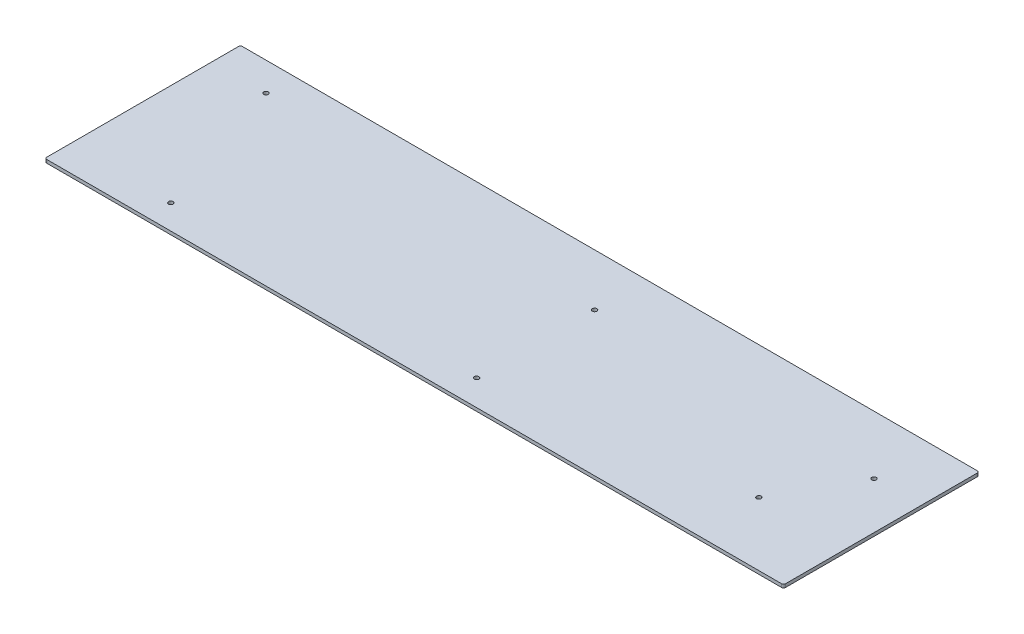
ISO-10303-21;
HEADER;
FILE_DESCRIPTION(('STEP AP214'),'2;1');
FILE_NAME('part.step','',(''),(''),'','','');
FILE_SCHEMA(('AUTOMOTIVE_DESIGN { 1 0 10303 214 1 1 1 1 }'));
ENDSEC;
DATA;
#1=APPLICATION_CONTEXT('core data for automotive mechanical design processes');
#2=APPLICATION_PROTOCOL_DEFINITION('international standard','automotive_design',2000,#1);
#3=PRODUCT_CONTEXT('',#1,'mechanical');
#4=PRODUCT('Part','Part','',(#3));
#5=PRODUCT_RELATED_PRODUCT_CATEGORY('part','',(#4));
#6=PRODUCT_DEFINITION_FORMATION('','',#4);
#7=PRODUCT_DEFINITION_CONTEXT('part definition',#1,'design');
#8=PRODUCT_DEFINITION('design','',#6,#7);
#9=PRODUCT_DEFINITION_SHAPE('','',#8);
#10=(LENGTH_UNIT() NAMED_UNIT(*) SI_UNIT(.MILLI.,.METRE.));
#11=(NAMED_UNIT(*) PLANE_ANGLE_UNIT() SI_UNIT($,.RADIAN.));
#12=(NAMED_UNIT(*) SI_UNIT($,.STERADIAN.) SOLID_ANGLE_UNIT());
#13=UNCERTAINTY_MEASURE_WITH_UNIT(LENGTH_MEASURE(1.E-05),#10,'distance_accuracy_value','');
#14=(GEOMETRIC_REPRESENTATION_CONTEXT(3) GLOBAL_UNCERTAINTY_ASSIGNED_CONTEXT((#13)) GLOBAL_UNIT_ASSIGNED_CONTEXT((#10,
#11,#12)) REPRESENTATION_CONTEXT('',''));
#15=CARTESIAN_POINT('',(0.,0.,0.));
#16=DIRECTION('',(0.,0.,1.));
#17=DIRECTION('',(1.,0.,0.));
#18=AXIS2_PLACEMENT_3D('',#15,#16,#17);
#19=CARTESIAN_POINT('',(178.825,1.6,46.625));
#20=DIRECTION('',(0.,1.,0.));
#21=DIRECTION('',(0.,0.,1.));
#22=AXIS2_PLACEMENT_3D('',#19,#20,#21);
#23=PLANE('',#22);
#24=CARTESIAN_POINT('',(17.875,1.6,35.075));
#25=DIRECTION('',(0.,1.,0.));
#26=DIRECTION('',(0.,0.,1.));
#27=AXIS2_PLACEMENT_3D('',#24,#25,#26);
#28=CIRCLE('',#27,1.09999999999999);
#29=CARTESIAN_POINT('',(17.875,1.6,36.175));
#30=VERTEX_POINT('',#29);
#31=EDGE_CURVE('E200',#30,#30,#28,.T.);
#32=ORIENTED_EDGE('',*,*,#31,.F.);
#33=EDGE_LOOP('',(#32));
#34=FACE_BOUND('',#33,.T.);
#35=CARTESIAN_POINT('',(-153.475,1.6,-33.725));
#36=DIRECTION('',(0.,1.,0.));
#37=DIRECTION('',(0.,0.,1.));
#38=AXIS2_PLACEMENT_3D('',#35,#36,#37);
#39=CIRCLE('',#38,1.09999999999999);
#40=CARTESIAN_POINT('',(-153.475,1.6,-32.625));
#41=VERTEX_POINT('',#40);
#42=EDGE_CURVE('E188',#41,#41,#39,.T.);
#43=ORIENTED_EDGE('',*,*,#42,.F.);
#44=EDGE_LOOP('',(#43));
#45=FACE_BOUND('',#44,.T.);
#46=CARTESIAN_POINT('',(157.075,1.6,-19.175));
#47=DIRECTION('',(0.,1.,0.));
#48=DIRECTION('',(0.,0.,1.));
#49=AXIS2_PLACEMENT_3D('',#46,#47,#48);
#50=CIRCLE('',#49,1.09999999999999);
#51=CARTESIAN_POINT('',(157.075,1.6,-18.075));
#52=VERTEX_POINT('',#51);
#53=EDGE_CURVE('E134',#52,#52,#50,.T.);
#54=ORIENTED_EDGE('',*,*,#53,.F.);
#55=EDGE_LOOP('',(#54));
#56=FACE_BOUND('',#55,.T.);
#57=CARTESIAN_POINT('',(178.825,1.6,46.625));
#58=DIRECTION('',(0.,1.,0.));
#59=DIRECTION('',(0.,0.,1.));
#60=AXIS2_PLACEMENT_3D('',#57,#58,#59);
#61=CIRCLE('',#60,0.999999999999987);
#62=CARTESIAN_POINT('',(178.825,1.6,47.625));
#63=VERTEX_POINT('',#62);
#64=CARTESIAN_POINT('',(179.825,1.6,46.625));
#65=VERTEX_POINT('',#64);
#66=EDGE_CURVE('E145',#63,#65,#61,.T.);
#67=ORIENTED_EDGE('',*,*,#66,.T.);
#68=DIRECTION('',(0.,0.,-1.));
#69=VECTOR('',#68,1.);
#70=CARTESIAN_POINT('',(179.825,1.6,-46.625));
#71=LINE('',#70,#69);
#72=CARTESIAN_POINT('',(179.825,1.6,-46.625));
#73=VERTEX_POINT('',#72);
#74=EDGE_CURVE('E93',#65,#73,#71,.T.);
#75=ORIENTED_EDGE('',*,*,#74,.T.);
#76=CARTESIAN_POINT('',(178.825,1.6,-46.625));
#77=DIRECTION('',(0.,1.,0.));
#78=DIRECTION('',(0.,0.,-1.));
#79=AXIS2_PLACEMENT_3D('',#76,#77,#78);
#80=CIRCLE('',#79,0.999999999999987);
#81=CARTESIAN_POINT('',(178.825,1.6,-47.625));
#82=VERTEX_POINT('',#81);
#83=EDGE_CURVE('E160',#73,#82,#80,.T.);
#84=ORIENTED_EDGE('',*,*,#83,.T.);
#85=DIRECTION('',(-1.,0.,0.));
#86=VECTOR('',#85,1.);
#87=CARTESIAN_POINT('',(-178.825,1.6,-47.625));
#88=LINE('',#87,#86);
#89=CARTESIAN_POINT('',(-178.825,1.6,-47.625));
#90=VERTEX_POINT('',#89);
#91=EDGE_CURVE('E173',#82,#90,#88,.T.);
#92=ORIENTED_EDGE('',*,*,#91,.T.);
#93=CARTESIAN_POINT('',(-178.825,1.6,-46.625));
#94=DIRECTION('',(0.,1.,0.));
#95=DIRECTION('',(0.,0.,1.));
#96=AXIS2_PLACEMENT_3D('',#93,#94,#95);
#97=CIRCLE('',#96,1.);
#98=CARTESIAN_POINT('',(-179.825,1.6,-46.625));
#99=VERTEX_POINT('',#98);
#100=EDGE_CURVE('E112',#90,#99,#97,.T.);
#101=ORIENTED_EDGE('',*,*,#100,.T.);
#102=DIRECTION('',(0.,0.,1.));
#103=VECTOR('',#102,1.);
#104=CARTESIAN_POINT('',(-179.825,1.6,-46.625));
#105=LINE('',#104,#103);
#106=CARTESIAN_POINT('',(-179.825,1.6,46.625));
#107=VERTEX_POINT('',#106);
#108=EDGE_CURVE('E106',#99,#107,#105,.T.);
#109=ORIENTED_EDGE('',*,*,#108,.T.);
#110=CARTESIAN_POINT('',(-178.825,1.6,46.625));
#111=DIRECTION('',(0.,1.,0.));
#112=DIRECTION('',(0.,0.,1.));
#113=AXIS2_PLACEMENT_3D('',#110,#111,#112);
#114=CIRCLE('',#113,1.);
#115=CARTESIAN_POINT('',(-178.825,1.6,47.625));
#116=VERTEX_POINT('',#115);
#117=EDGE_CURVE('E110',#107,#116,#114,.T.);
#118=ORIENTED_EDGE('',*,*,#117,.T.);
#119=DIRECTION('',(1.,0.,0.));
#120=VECTOR('',#119,1.);
#121=CARTESIAN_POINT('',(-178.825,1.6,47.625));
#122=LINE('',#121,#120);
#123=EDGE_CURVE('E50',#116,#63,#122,.T.);
#124=ORIENTED_EDGE('',*,*,#123,.T.);
#125=EDGE_LOOP('',(#67,#75,#84,#92,#101,#109,#118,#124));
#126=FACE_BOUND('',#125,.T.);
#127=CARTESIAN_POINT('',(136.925,1.6,16.775));
#128=DIRECTION('',(0.,1.,0.));
#129=DIRECTION('',(0.,0.,1.));
#130=AXIS2_PLACEMENT_3D('',#127,#128,#129);
#131=CIRCLE('',#130,1.09999999999999);
#132=CARTESIAN_POINT('',(136.925,1.6,17.875));
#133=VERTEX_POINT('',#132);
#134=EDGE_CURVE('E182',#133,#133,#131,.T.);
#135=ORIENTED_EDGE('',*,*,#134,.F.);
#136=EDGE_LOOP('',(#135));
#137=FACE_BOUND('',#136,.T.);
#138=CARTESIAN_POINT('',(17.925,1.6,-22.275));
#139=DIRECTION('',(0.,1.,0.));
#140=DIRECTION('',(0.,0.,1.));
#141=AXIS2_PLACEMENT_3D('',#138,#139,#140);
#142=CIRCLE('',#141,1.1);
#143=CARTESIAN_POINT('',(17.925,1.6,-21.175));
#144=VERTEX_POINT('',#143);
#145=EDGE_CURVE('E194',#144,#144,#142,.T.);
#146=ORIENTED_EDGE('',*,*,#145,.F.);
#147=EDGE_LOOP('',(#146));
#148=FACE_BOUND('',#147,.T.);
#149=CARTESIAN_POINT('',(-130.375,1.6,35.725));
#150=DIRECTION('',(0.,1.,0.));
#151=DIRECTION('',(0.,0.,1.));
#152=AXIS2_PLACEMENT_3D('',#149,#150,#151);
#153=CIRCLE('',#152,1.10000000000002);
#154=CARTESIAN_POINT('',(-130.375,1.6,36.825));
#155=VERTEX_POINT('',#154);
#156=EDGE_CURVE('E206',#155,#155,#153,.T.);
#157=ORIENTED_EDGE('',*,*,#156,.F.);
#158=EDGE_LOOP('',(#157));
#159=FACE_BOUND('',#158,.T.);
#160=ADVANCED_FACE('F33',(#34,#45,#56,#126,#137,#148,#159),#23,.T.);
#161=CARTESIAN_POINT('',(178.825,0.,46.625));
#162=DIRECTION('',(0.,1.,0.));
#163=DIRECTION('',(0.,0.,1.));
#164=AXIS2_PLACEMENT_3D('',#161,#162,#163);
#165=PLANE('',#164);
#166=CARTESIAN_POINT('',(178.825,0.,46.625));
#167=DIRECTION('',(0.,1.,0.));
#168=DIRECTION('',(0.,0.,1.));
#169=AXIS2_PLACEMENT_3D('',#166,#167,#168);
#170=CIRCLE('',#169,0.999999999999987);
#171=CARTESIAN_POINT('',(178.825,0.,47.625));
#172=VERTEX_POINT('',#171);
#173=CARTESIAN_POINT('',(179.825,0.,46.625));
#174=VERTEX_POINT('',#173);
#175=EDGE_CURVE('E130',#172,#174,#170,.T.);
#176=ORIENTED_EDGE('',*,*,#175,.F.);
#177=DIRECTION('',(1.,0.,0.));
#178=VECTOR('',#177,1.);
#179=CARTESIAN_POINT('',(-178.825,0.,47.625));
#180=LINE('',#179,#178);
#181=CARTESIAN_POINT('',(-178.825,0.,47.625));
#182=VERTEX_POINT('',#181);
#183=EDGE_CURVE('E85',#182,#172,#180,.T.);
#184=ORIENTED_EDGE('',*,*,#183,.F.);
#185=CARTESIAN_POINT('',(-178.825,0.,46.625));
#186=DIRECTION('',(0.,1.,0.));
#187=DIRECTION('',(0.,0.,1.));
#188=AXIS2_PLACEMENT_3D('',#185,#186,#187);
#189=CIRCLE('',#188,1.);
#190=CARTESIAN_POINT('',(-179.825,0.,46.625));
#191=VERTEX_POINT('',#190);
#192=EDGE_CURVE('E79',#191,#182,#189,.T.);
#193=ORIENTED_EDGE('',*,*,#192,.F.);
#194=DIRECTION('',(0.,0.,1.));
#195=VECTOR('',#194,1.);
#196=CARTESIAN_POINT('',(-179.825,0.,-46.625));
#197=LINE('',#196,#195);
#198=CARTESIAN_POINT('',(-179.825,0.,-46.625));
#199=VERTEX_POINT('',#198);
#200=EDGE_CURVE('E120',#199,#191,#197,.T.);
#201=ORIENTED_EDGE('',*,*,#200,.F.);
#202=CARTESIAN_POINT('',(-178.825,0.,-46.625));
#203=DIRECTION('',(0.,1.,0.));
#204=DIRECTION('',(0.,0.,1.));
#205=AXIS2_PLACEMENT_3D('',#202,#203,#204);
#206=CIRCLE('',#205,1.);
#207=CARTESIAN_POINT('',(-178.825,0.,-47.625));
#208=VERTEX_POINT('',#207);
#209=EDGE_CURVE('E140',#208,#199,#206,.T.);
#210=ORIENTED_EDGE('',*,*,#209,.F.);
#211=DIRECTION('',(-1.,0.,0.));
#212=VECTOR('',#211,1.);
#213=CARTESIAN_POINT('',(-178.825,0.,-47.625));
#214=LINE('',#213,#212);
#215=CARTESIAN_POINT('',(178.825,0.,-47.625));
#216=VERTEX_POINT('',#215);
#217=EDGE_CURVE('E138',#216,#208,#214,.T.);
#218=ORIENTED_EDGE('',*,*,#217,.F.);
#219=CARTESIAN_POINT('',(178.825,0.,-46.625));
#220=DIRECTION('',(0.,1.,0.));
#221=DIRECTION('',(0.,0.,-1.));
#222=AXIS2_PLACEMENT_3D('',#219,#220,#221);
#223=CIRCLE('',#222,0.999999999999987);
#224=CARTESIAN_POINT('',(179.825,0.,-46.625));
#225=VERTEX_POINT('',#224);
#226=EDGE_CURVE('E136',#225,#216,#223,.T.);
#227=ORIENTED_EDGE('',*,*,#226,.F.);
#228=DIRECTION('',(0.,0.,-1.));
#229=VECTOR('',#228,1.);
#230=CARTESIAN_POINT('',(179.825,0.,-46.625));
#231=LINE('',#230,#229);
#232=EDGE_CURVE('E133',#174,#225,#231,.T.);
#233=ORIENTED_EDGE('',*,*,#232,.F.);
#234=EDGE_LOOP('',(#176,#184,#193,#201,#210,#218,#227,#233));
#235=FACE_BOUND('',#234,.T.);
#236=CARTESIAN_POINT('',(157.075,0.,-19.175));
#237=DIRECTION('',(0.,1.,0.));
#238=DIRECTION('',(0.,0.,1.));
#239=AXIS2_PLACEMENT_3D('',#236,#237,#238);
#240=CIRCLE('',#239,1.09999999999999);
#241=CARTESIAN_POINT('',(157.075,0.,-18.075));
#242=VERTEX_POINT('',#241);
#243=EDGE_CURVE('E179',#242,#242,#240,.T.);
#244=ORIENTED_EDGE('',*,*,#243,.T.);
#245=EDGE_LOOP('',(#244));
#246=FACE_BOUND('',#245,.T.);
#247=CARTESIAN_POINT('',(136.925,0.,16.775));
#248=DIRECTION('',(0.,1.,0.));
#249=DIRECTION('',(0.,0.,1.));
#250=AXIS2_PLACEMENT_3D('',#247,#248,#249);
#251=CIRCLE('',#250,1.09999999999999);
#252=CARTESIAN_POINT('',(136.925,0.,17.875));
#253=VERTEX_POINT('',#252);
#254=EDGE_CURVE('E185',#253,#253,#251,.T.);
#255=ORIENTED_EDGE('',*,*,#254,.T.);
#256=EDGE_LOOP('',(#255));
#257=FACE_BOUND('',#256,.T.);
#258=CARTESIAN_POINT('',(-153.475,0.,-33.725));
#259=DIRECTION('',(0.,1.,0.));
#260=DIRECTION('',(0.,0.,1.));
#261=AXIS2_PLACEMENT_3D('',#258,#259,#260);
#262=CIRCLE('',#261,1.09999999999999);
#263=CARTESIAN_POINT('',(-153.475,0.,-32.625));
#264=VERTEX_POINT('',#263);
#265=EDGE_CURVE('E191',#264,#264,#262,.T.);
#266=ORIENTED_EDGE('',*,*,#265,.T.);
#267=EDGE_LOOP('',(#266));
#268=FACE_BOUND('',#267,.T.);
#269=CARTESIAN_POINT('',(17.925,0.,-22.275));
#270=DIRECTION('',(0.,1.,0.));
#271=DIRECTION('',(0.,0.,1.));
#272=AXIS2_PLACEMENT_3D('',#269,#270,#271);
#273=CIRCLE('',#272,1.1);
#274=CARTESIAN_POINT('',(17.925,0.,-21.175));
#275=VERTEX_POINT('',#274);
#276=EDGE_CURVE('E197',#275,#275,#273,.T.);
#277=ORIENTED_EDGE('',*,*,#276,.T.);
#278=EDGE_LOOP('',(#277));
#279=FACE_BOUND('',#278,.T.);
#280=CARTESIAN_POINT('',(17.875,0.,35.075));
#281=DIRECTION('',(0.,1.,0.));
#282=DIRECTION('',(0.,0.,1.));
#283=AXIS2_PLACEMENT_3D('',#280,#281,#282);
#284=CIRCLE('',#283,1.09999999999999);
#285=CARTESIAN_POINT('',(17.875,0.,36.175));
#286=VERTEX_POINT('',#285);
#287=EDGE_CURVE('E203',#286,#286,#284,.T.);
#288=ORIENTED_EDGE('',*,*,#287,.T.);
#289=EDGE_LOOP('',(#288));
#290=FACE_BOUND('',#289,.T.);
#291=CARTESIAN_POINT('',(-130.375,0.,35.725));
#292=DIRECTION('',(0.,1.,0.));
#293=DIRECTION('',(0.,0.,1.));
#294=AXIS2_PLACEMENT_3D('',#291,#292,#293);
#295=CIRCLE('',#294,1.10000000000002);
#296=CARTESIAN_POINT('',(-130.375,0.,36.825));
#297=VERTEX_POINT('',#296);
#298=EDGE_CURVE('E209',#297,#297,#295,.T.);
#299=ORIENTED_EDGE('',*,*,#298,.T.);
#300=EDGE_LOOP('',(#299));
#301=FACE_BOUND('',#300,.T.);
#302=ADVANCED_FACE('F164',(#235,#246,#257,#268,#279,#290,#301),#165,.F.);
#303=CARTESIAN_POINT('',(178.825,1.6,46.625));
#304=DIRECTION('',(0.,-1.,0.));
#305=DIRECTION('',(0.,0.,-1.));
#306=AXIS2_PLACEMENT_3D('',#303,#304,#305);
#307=CYLINDRICAL_SURFACE('',#306,0.999999999999987);
#308=ORIENTED_EDGE('',*,*,#175,.T.);
#309=DIRECTION('',(0.,-1.,0.));
#310=VECTOR('',#309,1.);
#311=CARTESIAN_POINT('',(179.825,1.6,46.625));
#312=LINE('',#311,#310);
#313=EDGE_CURVE('E11',#65,#174,#312,.T.);
#314=ORIENTED_EDGE('',*,*,#313,.F.);
#315=ORIENTED_EDGE('',*,*,#66,.F.);
#316=DIRECTION('',(0.,-1.,0.));
#317=VECTOR('',#316,1.);
#318=CARTESIAN_POINT('',(178.825,1.6,47.625));
#319=LINE('',#318,#317);
#320=EDGE_CURVE('E126',#63,#172,#319,.T.);
#321=ORIENTED_EDGE('',*,*,#320,.T.);
#322=EDGE_LOOP('',(#308,#314,#315,#321));
#323=FACE_BOUND('',#322,.T.);
#324=ADVANCED_FACE('F35',(#323),#307,.T.);
#325=CARTESIAN_POINT('',(179.825,1.6,-46.625));
#326=DIRECTION('',(-1.,0.,0.));
#327=DIRECTION('',(0.,0.,1.));
#328=AXIS2_PLACEMENT_3D('',#325,#326,#327);
#329=PLANE('',#328);
#330=ORIENTED_EDGE('',*,*,#232,.T.);
#331=DIRECTION('',(0.,-1.,0.));
#332=VECTOR('',#331,1.);
#333=CARTESIAN_POINT('',(179.825,1.6,-46.625));
#334=LINE('',#333,#332);
#335=EDGE_CURVE('E42',#73,#225,#334,.T.);
#336=ORIENTED_EDGE('',*,*,#335,.F.);
#337=ORIENTED_EDGE('',*,*,#74,.F.);
#338=ORIENTED_EDGE('',*,*,#313,.T.);
#339=EDGE_LOOP('',(#330,#336,#337,#338));
#340=FACE_BOUND('',#339,.T.);
#341=ADVANCED_FACE('F243',(#340),#329,.F.);
#342=CARTESIAN_POINT('',(178.825,1.6,-46.625));
#343=DIRECTION('',(0.,-1.,0.));
#344=DIRECTION('',(0.,0.,-1.));
#345=AXIS2_PLACEMENT_3D('',#342,#343,#344);
#346=CYLINDRICAL_SURFACE('',#345,0.999999999999987);
#347=ORIENTED_EDGE('',*,*,#226,.T.);
#348=DIRECTION('',(0.,-1.,0.));
#349=VECTOR('',#348,1.);
#350=CARTESIAN_POINT('',(178.825,1.6,-47.625));
#351=LINE('',#350,#349);
#352=EDGE_CURVE('E152',#82,#216,#351,.T.);
#353=ORIENTED_EDGE('',*,*,#352,.F.);
#354=ORIENTED_EDGE('',*,*,#83,.F.);
#355=ORIENTED_EDGE('',*,*,#335,.T.);
#356=EDGE_LOOP('',(#347,#353,#354,#355));
#357=FACE_BOUND('',#356,.T.);
#358=ADVANCED_FACE('F158',(#357),#346,.T.);
#359=CARTESIAN_POINT('',(-178.825,1.6,-47.625));
#360=DIRECTION('',(0.,0.,1.));
#361=DIRECTION('',(1.,0.,0.));
#362=AXIS2_PLACEMENT_3D('',#359,#360,#361);
#363=PLANE('',#362);
#364=ORIENTED_EDGE('',*,*,#217,.T.);
#365=DIRECTION('',(0.,-1.,0.));
#366=VECTOR('',#365,1.);
#367=CARTESIAN_POINT('',(-178.825,1.6,-47.625));
#368=LINE('',#367,#366);
#369=EDGE_CURVE('E149',#90,#208,#368,.T.);
#370=ORIENTED_EDGE('',*,*,#369,.F.);
#371=ORIENTED_EDGE('',*,*,#91,.F.);
#372=ORIENTED_EDGE('',*,*,#352,.T.);
#373=EDGE_LOOP('',(#364,#370,#371,#372));
#374=FACE_BOUND('',#373,.T.);
#375=ADVANCED_FACE('F169',(#374),#363,.F.);
#376=CARTESIAN_POINT('',(-178.825,1.6,-46.625));
#377=DIRECTION('',(0.,-1.,0.));
#378=DIRECTION('',(0.,0.,-1.));
#379=AXIS2_PLACEMENT_3D('',#376,#377,#378);
#380=CYLINDRICAL_SURFACE('',#379,1.);
#381=ORIENTED_EDGE('',*,*,#209,.T.);
#382=DIRECTION('',(0.,-1.,0.));
#383=VECTOR('',#382,1.);
#384=CARTESIAN_POINT('',(-179.825,1.6,-46.625));
#385=LINE('',#384,#383);
#386=EDGE_CURVE('E121',#99,#199,#385,.T.);
#387=ORIENTED_EDGE('',*,*,#386,.F.);
#388=ORIENTED_EDGE('',*,*,#100,.F.);
#389=ORIENTED_EDGE('',*,*,#369,.T.);
#390=EDGE_LOOP('',(#381,#387,#388,#389));
#391=FACE_BOUND('',#390,.T.);
#392=ADVANCED_FACE('F172',(#391),#380,.T.);
#393=CARTESIAN_POINT('',(-179.825,1.6,-46.625));
#394=DIRECTION('',(1.,0.,0.));
#395=DIRECTION('',(0.,0.,-1.));
#396=AXIS2_PLACEMENT_3D('',#393,#394,#395);
#397=PLANE('',#396);
#398=ORIENTED_EDGE('',*,*,#200,.T.);
#399=DIRECTION('',(0.,-1.,0.));
#400=VECTOR('',#399,1.);
#401=CARTESIAN_POINT('',(-179.825,1.6,46.625));
#402=LINE('',#401,#400);
#403=EDGE_CURVE('E117',#107,#191,#402,.T.);
#404=ORIENTED_EDGE('',*,*,#403,.F.);
#405=ORIENTED_EDGE('',*,*,#108,.F.);
#406=ORIENTED_EDGE('',*,*,#386,.T.);
#407=EDGE_LOOP('',(#398,#404,#405,#406));
#408=FACE_BOUND('',#407,.T.);
#409=ADVANCED_FACE('F118',(#408),#397,.F.);
#410=CARTESIAN_POINT('',(-178.825,1.6,46.625));
#411=DIRECTION('',(0.,-1.,0.));
#412=DIRECTION('',(0.,0.,-1.));
#413=AXIS2_PLACEMENT_3D('',#410,#411,#412);
#414=CYLINDRICAL_SURFACE('',#413,1.);
#415=ORIENTED_EDGE('',*,*,#192,.T.);
#416=DIRECTION('',(0.,-1.,0.));
#417=VECTOR('',#416,1.);
#418=CARTESIAN_POINT('',(-178.825,1.6,47.625));
#419=LINE('',#418,#417);
#420=EDGE_CURVE('E122',#116,#182,#419,.T.);
#421=ORIENTED_EDGE('',*,*,#420,.F.);
#422=ORIENTED_EDGE('',*,*,#117,.F.);
#423=ORIENTED_EDGE('',*,*,#403,.T.);
#424=EDGE_LOOP('',(#415,#421,#422,#423));
#425=FACE_BOUND('',#424,.T.);
#426=ADVANCED_FACE('F124',(#425),#414,.T.);
#427=CARTESIAN_POINT('',(-178.825,1.6,47.625));
#428=DIRECTION('',(0.,0.,-1.));
#429=DIRECTION('',(-1.,0.,0.));
#430=AXIS2_PLACEMENT_3D('',#427,#428,#429);
#431=PLANE('',#430);
#432=ORIENTED_EDGE('',*,*,#183,.T.);
#433=ORIENTED_EDGE('',*,*,#320,.F.);
#434=ORIENTED_EDGE('',*,*,#123,.F.);
#435=ORIENTED_EDGE('',*,*,#420,.T.);
#436=EDGE_LOOP('',(#432,#433,#434,#435));
#437=FACE_BOUND('',#436,.T.);
#438=ADVANCED_FACE('F231',(#437),#431,.F.);
#439=CARTESIAN_POINT('',(157.075,1.6,-19.175));
#440=DIRECTION('',(0.,-1.,0.));
#441=DIRECTION('',(0.,0.,-1.));
#442=AXIS2_PLACEMENT_3D('',#439,#440,#441);
#443=CYLINDRICAL_SURFACE('',#442,1.09999999999999);
#444=ORIENTED_EDGE('',*,*,#53,.T.);
#445=EDGE_LOOP('',(#444));
#446=FACE_BOUND('',#445,.T.);
#447=ORIENTED_EDGE('',*,*,#243,.F.);
#448=EDGE_LOOP('',(#447));
#449=FACE_BOUND('',#448,.T.);
#450=ADVANCED_FACE('F228',(#446,#449),#443,.F.);
#451=CARTESIAN_POINT('',(136.925,1.6,16.775));
#452=DIRECTION('',(0.,-1.,0.));
#453=DIRECTION('',(0.,0.,-1.));
#454=AXIS2_PLACEMENT_3D('',#451,#452,#453);
#455=CYLINDRICAL_SURFACE('',#454,1.09999999999999);
#456=ORIENTED_EDGE('',*,*,#134,.T.);
#457=EDGE_LOOP('',(#456));
#458=FACE_BOUND('',#457,.T.);
#459=ORIENTED_EDGE('',*,*,#254,.F.);
#460=EDGE_LOOP('',(#459));
#461=FACE_BOUND('',#460,.T.);
#462=ADVANCED_FACE('F307',(#458,#461),#455,.F.);
#463=CARTESIAN_POINT('',(-153.475,1.6,-33.725));
#464=DIRECTION('',(0.,-1.,0.));
#465=DIRECTION('',(0.,0.,-1.));
#466=AXIS2_PLACEMENT_3D('',#463,#464,#465);
#467=CYLINDRICAL_SURFACE('',#466,1.09999999999999);
#468=ORIENTED_EDGE('',*,*,#42,.T.);
#469=EDGE_LOOP('',(#468));
#470=FACE_BOUND('',#469,.T.);
#471=ORIENTED_EDGE('',*,*,#265,.F.);
#472=EDGE_LOOP('',(#471));
#473=FACE_BOUND('',#472,.T.);
#474=ADVANCED_FACE('F315',(#470,#473),#467,.F.);
#475=CARTESIAN_POINT('',(17.925,1.6,-22.275));
#476=DIRECTION('',(0.,-1.,0.));
#477=DIRECTION('',(0.,0.,-1.));
#478=AXIS2_PLACEMENT_3D('',#475,#476,#477);
#479=CYLINDRICAL_SURFACE('',#478,1.1);
#480=ORIENTED_EDGE('',*,*,#145,.T.);
#481=EDGE_LOOP('',(#480));
#482=FACE_BOUND('',#481,.T.);
#483=ORIENTED_EDGE('',*,*,#276,.F.);
#484=EDGE_LOOP('',(#483));
#485=FACE_BOUND('',#484,.T.);
#486=ADVANCED_FACE('F323',(#482,#485),#479,.F.);
#487=CARTESIAN_POINT('',(17.875,1.6,35.075));
#488=DIRECTION('',(0.,-1.,0.));
#489=DIRECTION('',(0.,0.,-1.));
#490=AXIS2_PLACEMENT_3D('',#487,#488,#489);
#491=CYLINDRICAL_SURFACE('',#490,1.09999999999999);
#492=ORIENTED_EDGE('',*,*,#31,.T.);
#493=EDGE_LOOP('',(#492));
#494=FACE_BOUND('',#493,.T.);
#495=ORIENTED_EDGE('',*,*,#287,.F.);
#496=EDGE_LOOP('',(#495));
#497=FACE_BOUND('',#496,.T.);
#498=ADVANCED_FACE('F332',(#494,#497),#491,.F.);
#499=CARTESIAN_POINT('',(-130.375,1.6,35.725));
#500=DIRECTION('',(0.,-1.,0.));
#501=DIRECTION('',(0.,0.,-1.));
#502=AXIS2_PLACEMENT_3D('',#499,#500,#501);
#503=CYLINDRICAL_SURFACE('',#502,1.10000000000002);
#504=ORIENTED_EDGE('',*,*,#156,.T.);
#505=EDGE_LOOP('',(#504));
#506=FACE_BOUND('',#505,.T.);
#507=ORIENTED_EDGE('',*,*,#298,.F.);
#508=EDGE_LOOP('',(#507));
#509=FACE_BOUND('',#508,.T.);
#510=ADVANCED_FACE('F215',(#506,#509),#503,.F.);
#511=CLOSED_SHELL('',(#160,#302,#324,#341,#358,#375,#392,#409,#426,#438,#450,#462,#474,#486,
#498,#510));
#512=MANIFOLD_SOLID_BREP('B2',#511);
#513=ADVANCED_BREP_SHAPE_REPRESENTATION('',(#18,#512),#14);
#514=SHAPE_DEFINITION_REPRESENTATION(#9,#513);
ENDSEC;
END-ISO-10303-21;
